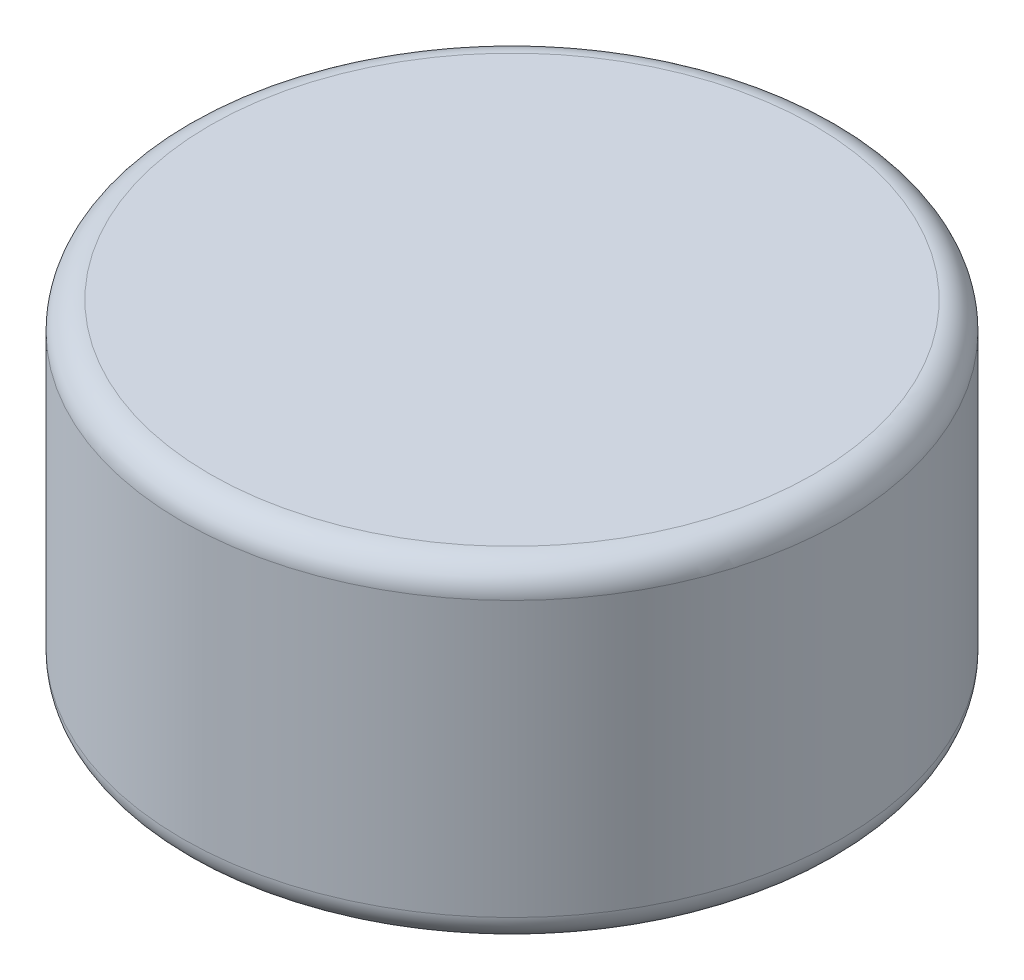
ISO-10303-21;
HEADER;
FILE_DESCRIPTION(('STEP AP214'),'2;1');
FILE_NAME('part.step','',(''),(''),'','','');
FILE_SCHEMA(('AUTOMOTIVE_DESIGN { 1 0 10303 214 1 1 1 1 }'));
ENDSEC;
DATA;
#1=APPLICATION_CONTEXT('core data for automotive mechanical design processes');
#2=APPLICATION_PROTOCOL_DEFINITION('international standard','automotive_design',2000,#1);
#3=PRODUCT_CONTEXT('',#1,'mechanical');
#4=PRODUCT('Part','Part','',(#3));
#5=PRODUCT_RELATED_PRODUCT_CATEGORY('part','',(#4));
#6=PRODUCT_DEFINITION_FORMATION('','',#4);
#7=PRODUCT_DEFINITION_CONTEXT('part definition',#1,'design');
#8=PRODUCT_DEFINITION('design','',#6,#7);
#9=PRODUCT_DEFINITION_SHAPE('','',#8);
#10=(LENGTH_UNIT() NAMED_UNIT(*) SI_UNIT(.MILLI.,.METRE.));
#11=(NAMED_UNIT(*) PLANE_ANGLE_UNIT() SI_UNIT($,.RADIAN.));
#12=(NAMED_UNIT(*) SI_UNIT($,.STERADIAN.) SOLID_ANGLE_UNIT());
#13=UNCERTAINTY_MEASURE_WITH_UNIT(LENGTH_MEASURE(1.E-05),#10,'distance_accuracy_value','');
#14=(GEOMETRIC_REPRESENTATION_CONTEXT(3) GLOBAL_UNCERTAINTY_ASSIGNED_CONTEXT((#13)) GLOBAL_UNIT_ASSIGNED_CONTEXT((#10,
#11,#12)) REPRESENTATION_CONTEXT('',''));
#15=CARTESIAN_POINT('',(0.,0.,0.));
#16=DIRECTION('',(0.,0.,1.));
#17=DIRECTION('',(1.,0.,0.));
#18=AXIS2_PLACEMENT_3D('',#15,#16,#17);
#19=CARTESIAN_POINT('',(0.,3.,0.));
#20=DIRECTION('',(0.,-1.,0.));
#21=DIRECTION('',(0.,0.,-1.));
#22=AXIS2_PLACEMENT_3D('',#19,#20,#21);
#23=CYLINDRICAL_SURFACE('',#22,3.);
#24=CARTESIAN_POINT('',(0.,0.25,0.));
#25=DIRECTION('',(0.,1.,0.));
#26=DIRECTION('',(0.,0.,1.));
#27=AXIS2_PLACEMENT_3D('',#24,#25,#26);
#28=CIRCLE('',#27,3.);
#29=CARTESIAN_POINT('',(0.,0.25,3.));
#30=VERTEX_POINT('',#29);
#31=EDGE_CURVE('E42',#30,#30,#28,.T.);
#32=ORIENTED_EDGE('',*,*,#31,.T.);
#33=EDGE_LOOP('',(#32));
#34=FACE_BOUND('',#33,.T.);
#35=CARTESIAN_POINT('',(0.,2.75,0.));
#36=DIRECTION('',(0.,1.,0.));
#37=DIRECTION('',(0.,0.,1.));
#38=AXIS2_PLACEMENT_3D('',#35,#36,#37);
#39=CIRCLE('',#38,3.);
#40=CARTESIAN_POINT('',(0.,2.75,3.));
#41=VERTEX_POINT('',#40);
#42=EDGE_CURVE('E46',#41,#41,#39,.F.);
#43=ORIENTED_EDGE('',*,*,#42,.T.);
#44=EDGE_LOOP('',(#43));
#45=FACE_BOUND('',#44,.T.);
#46=ADVANCED_FACE('F31',(#34,#45),#23,.T.);
#47=CARTESIAN_POINT('',(0.,3.,0.));
#48=DIRECTION('',(0.,1.,0.));
#49=DIRECTION('',(0.,0.,1.));
#50=AXIS2_PLACEMENT_3D('',#47,#48,#49);
#51=PLANE('',#50);
#52=CARTESIAN_POINT('',(0.,3.,0.));
#53=DIRECTION('',(0.,1.,0.));
#54=DIRECTION('',(0.,0.,1.));
#55=AXIS2_PLACEMENT_3D('',#52,#53,#54);
#56=CIRCLE('',#55,2.75);
#57=CARTESIAN_POINT('',(0.,3.,2.75));
#58=VERTEX_POINT('',#57);
#59=EDGE_CURVE('E10',#58,#58,#56,.T.);
#60=ORIENTED_EDGE('',*,*,#59,.T.);
#61=EDGE_LOOP('',(#60));
#62=FACE_BOUND('',#61,.T.);
#63=ADVANCED_FACE('F62',(#62),#51,.T.);
#64=CARTESIAN_POINT('',(0.,0.,0.));
#65=DIRECTION('',(0.,1.,0.));
#66=DIRECTION('',(0.,0.,1.));
#67=AXIS2_PLACEMENT_3D('',#64,#65,#66);
#68=PLANE('',#67);
#69=CARTESIAN_POINT('',(0.,0.,0.));
#70=DIRECTION('',(0.,1.,0.));
#71=DIRECTION('',(0.,0.,1.));
#72=AXIS2_PLACEMENT_3D('',#69,#70,#71);
#73=CIRCLE('',#72,2.75);
#74=CARTESIAN_POINT('',(0.,0.,2.75));
#75=VERTEX_POINT('',#74);
#76=EDGE_CURVE('E38',#75,#75,#73,.F.);
#77=ORIENTED_EDGE('',*,*,#76,.T.);
#78=EDGE_LOOP('',(#77));
#79=FACE_BOUND('',#78,.T.);
#80=ADVANCED_FACE('F59',(#79),#68,.F.);
#81=CARTESIAN_POINT('',(0.,0.25,0.));
#82=DIRECTION('',(0.,1.,0.));
#83=DIRECTION('',(0.,0.,1.));
#84=AXIS2_PLACEMENT_3D('',#81,#82,#83);
#85=TOROIDAL_SURFACE('',#84,2.75,0.25);
#86=ORIENTED_EDGE('',*,*,#76,.F.);
#87=EDGE_LOOP('',(#86));
#88=FACE_BOUND('',#87,.T.);
#89=ORIENTED_EDGE('',*,*,#31,.F.);
#90=EDGE_LOOP('',(#89));
#91=FACE_BOUND('',#90,.T.);
#92=ADVANCED_FACE('F55',(#88,#91),#85,.T.);
#93=CARTESIAN_POINT('',(0.,2.75,0.));
#94=DIRECTION('',(0.,1.,0.));
#95=DIRECTION('',(0.,0.,1.));
#96=AXIS2_PLACEMENT_3D('',#93,#94,#95);
#97=TOROIDAL_SURFACE('',#96,2.75,0.25);
#98=ORIENTED_EDGE('',*,*,#42,.F.);
#99=EDGE_LOOP('',(#98));
#100=FACE_BOUND('',#99,.T.);
#101=ORIENTED_EDGE('',*,*,#59,.F.);
#102=EDGE_LOOP('',(#101));
#103=FACE_BOUND('',#102,.T.);
#104=ADVANCED_FACE('F33',(#100,#103),#97,.T.);
#105=CLOSED_SHELL('',(#46,#63,#80,#92,#104));
#106=MANIFOLD_SOLID_BREP('B2',#105);
#107=ADVANCED_BREP_SHAPE_REPRESENTATION('',(#18,#106),#14);
#108=SHAPE_DEFINITION_REPRESENTATION(#9,#107);
ENDSEC;
END-ISO-10303-21;
